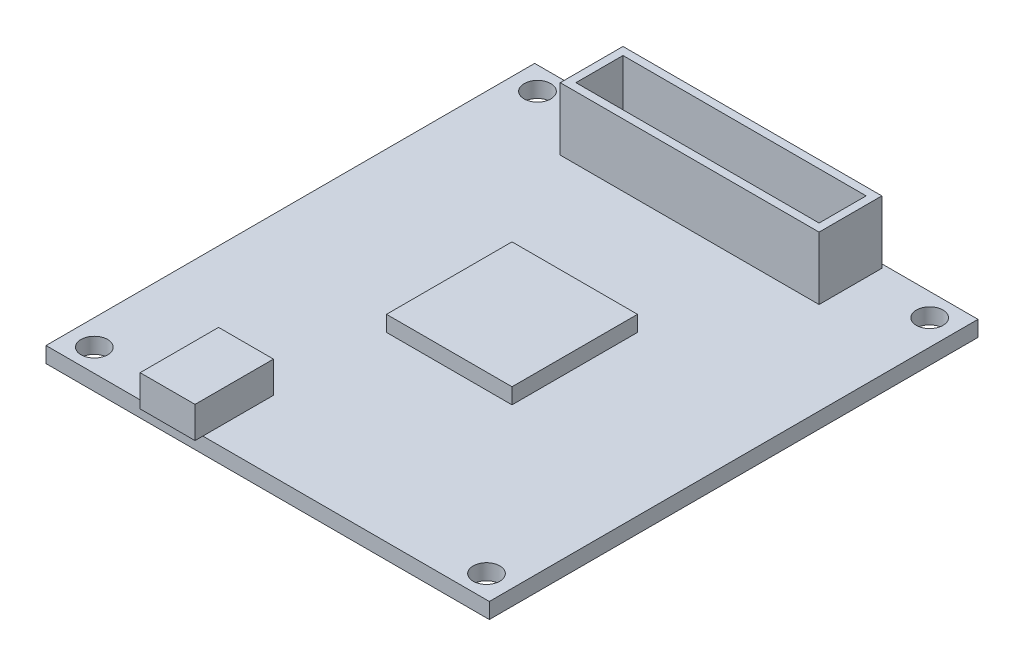
ISO-10303-21;
HEADER;
FILE_DESCRIPTION(('STEP AP214'),'2;1');
FILE_NAME('part.step','',(''),(''),'','','');
FILE_SCHEMA(('AUTOMOTIVE_DESIGN { 1 0 10303 214 1 1 1 1 }'));
ENDSEC;
DATA;
#1=APPLICATION_CONTEXT('core data for automotive mechanical design processes');
#2=APPLICATION_PROTOCOL_DEFINITION('international standard','automotive_design',2000,#1);
#3=PRODUCT_CONTEXT('',#1,'mechanical');
#4=PRODUCT('Part','Part','',(#3));
#5=PRODUCT_RELATED_PRODUCT_CATEGORY('part','',(#4));
#6=PRODUCT_DEFINITION_FORMATION('','',#4);
#7=PRODUCT_DEFINITION_CONTEXT('part definition',#1,'design');
#8=PRODUCT_DEFINITION('design','',#6,#7);
#9=PRODUCT_DEFINITION_SHAPE('','',#8);
#10=(LENGTH_UNIT() NAMED_UNIT(*) SI_UNIT(.MILLI.,.METRE.));
#11=(NAMED_UNIT(*) PLANE_ANGLE_UNIT() SI_UNIT($,.RADIAN.));
#12=(NAMED_UNIT(*) SI_UNIT($,.STERADIAN.) SOLID_ANGLE_UNIT());
#13=UNCERTAINTY_MEASURE_WITH_UNIT(LENGTH_MEASURE(1.E-05),#10,'distance_accuracy_value','');
#14=(GEOMETRIC_REPRESENTATION_CONTEXT(3) GLOBAL_UNCERTAINTY_ASSIGNED_CONTEXT((#13)) GLOBAL_UNIT_ASSIGNED_CONTEXT((#10,
#11,#12)) REPRESENTATION_CONTEXT('',''));
#15=CARTESIAN_POINT('',(0.,0.,0.));
#16=DIRECTION('',(0.,0.,1.));
#17=DIRECTION('',(1.,0.,0.));
#18=AXIS2_PLACEMENT_3D('',#15,#16,#17);
#19=CARTESIAN_POINT('',(0.,2.,0.));
#20=DIRECTION('',(0.,-1.,0.));
#21=DIRECTION('',(0.,0.,-1.));
#22=AXIS2_PLACEMENT_3D('',#19,#20,#21);
#23=PLANE('',#22);
#24=DIRECTION('',(0.,0.,1.));
#25=VECTOR('',#24,1.);
#26=CARTESIAN_POINT('',(-16.5,2.,-30.65));
#27=LINE('',#26,#25);
#28=CARTESIAN_POINT('',(-16.5,2.,-30.65));
#29=VERTEX_POINT('',#28);
#30=CARTESIAN_POINT('',(-16.5,2.,-22.65));
#31=VERTEX_POINT('',#30);
#32=EDGE_CURVE('E235',#29,#31,#27,.T.);
#33=ORIENTED_EDGE('',*,*,#32,.F.);
#34=DIRECTION('',(-1.,0.,0.));
#35=VECTOR('',#34,1.);
#36=CARTESIAN_POINT('',(16.5,2.,-30.65));
#37=LINE('',#36,#35);
#38=CARTESIAN_POINT('',(16.5,2.,-30.65));
#39=VERTEX_POINT('',#38);
#40=EDGE_CURVE('E246',#39,#29,#37,.T.);
#41=ORIENTED_EDGE('',*,*,#40,.F.);
#42=DIRECTION('',(0.,0.,-1.));
#43=VECTOR('',#42,1.);
#44=CARTESIAN_POINT('',(16.5,2.,-30.65));
#45=LINE('',#44,#43);
#46=CARTESIAN_POINT('',(16.5,2.,-22.65));
#47=VERTEX_POINT('',#46);
#48=EDGE_CURVE('E258',#47,#39,#45,.T.);
#49=ORIENTED_EDGE('',*,*,#48,.F.);
#50=DIRECTION('',(1.,0.,0.));
#51=VECTOR('',#50,1.);
#52=CARTESIAN_POINT('',(16.5,2.,-22.65));
#53=LINE('',#52,#51);
#54=EDGE_CURVE('E255',#31,#47,#53,.T.);
#55=ORIENTED_EDGE('',*,*,#54,.F.);
#56=EDGE_LOOP('',(#33,#41,#49,#55));
#57=FACE_BOUND('',#56,.T.);
#58=CARTESIAN_POINT('',(-25.,2.,-28.25));
#59=DIRECTION('',(0.,1.,0.));
#60=DIRECTION('',(0.,0.,-1.));
#61=AXIS2_PLACEMENT_3D('',#58,#59,#60);
#62=CIRCLE('',#61,1.7);
#63=CARTESIAN_POINT('',(-25.,2.,-29.95));
#64=VERTEX_POINT('',#63);
#65=EDGE_CURVE('E308',#64,#64,#62,.T.);
#66=ORIENTED_EDGE('',*,*,#65,.F.);
#67=EDGE_LOOP('',(#66));
#68=FACE_BOUND('',#67,.T.);
#69=CARTESIAN_POINT('',(-25.,2.,28.25));
#70=DIRECTION('',(0.,1.,0.));
#71=DIRECTION('',(0.,0.,1.));
#72=AXIS2_PLACEMENT_3D('',#69,#70,#71);
#73=CIRCLE('',#72,1.7);
#74=CARTESIAN_POINT('',(-25.,2.,29.95));
#75=VERTEX_POINT('',#74);
#76=EDGE_CURVE('E314',#75,#75,#73,.T.);
#77=ORIENTED_EDGE('',*,*,#76,.F.);
#78=EDGE_LOOP('',(#77));
#79=FACE_BOUND('',#78,.T.);
#80=CARTESIAN_POINT('',(25.,2.,28.25));
#81=DIRECTION('',(0.,1.,0.));
#82=DIRECTION('',(0.,0.,-1.));
#83=AXIS2_PLACEMENT_3D('',#80,#81,#82);
#84=CIRCLE('',#83,1.7);
#85=CARTESIAN_POINT('',(25.,2.,26.55));
#86=VERTEX_POINT('',#85);
#87=EDGE_CURVE('E320',#86,#86,#84,.T.);
#88=ORIENTED_EDGE('',*,*,#87,.F.);
#89=EDGE_LOOP('',(#88));
#90=FACE_BOUND('',#89,.T.);
#91=CARTESIAN_POINT('',(25.,2.,-28.25));
#92=DIRECTION('',(0.,1.,0.));
#93=DIRECTION('',(0.,0.,1.));
#94=AXIS2_PLACEMENT_3D('',#91,#92,#93);
#95=CIRCLE('',#94,1.7);
#96=CARTESIAN_POINT('',(25.,2.,-26.55));
#97=VERTEX_POINT('',#96);
#98=EDGE_CURVE('E326',#97,#97,#95,.T.);
#99=ORIENTED_EDGE('',*,*,#98,.F.);
#100=EDGE_LOOP('',(#99));
#101=FACE_BOUND('',#100,.T.);
#102=DIRECTION('',(0.,0.,-1.));
#103=VECTOR('',#102,1.);
#104=CARTESIAN_POINT('',(8.,2.,-8.));
#105=LINE('',#104,#103);
#106=CARTESIAN_POINT('',(8.,2.,8.));
#107=VERTEX_POINT('',#106);
#108=CARTESIAN_POINT('',(8.,2.,-8.));
#109=VERTEX_POINT('',#108);
#110=EDGE_CURVE('E274',#107,#109,#105,.T.);
#111=ORIENTED_EDGE('',*,*,#110,.F.);
#112=DIRECTION('',(1.,0.,0.));
#113=VECTOR('',#112,1.);
#114=CARTESIAN_POINT('',(-8.,2.,8.));
#115=LINE('',#114,#113);
#116=CARTESIAN_POINT('',(-8.,2.,8.));
#117=VERTEX_POINT('',#116);
#118=EDGE_CURVE('E279',#117,#107,#115,.T.);
#119=ORIENTED_EDGE('',*,*,#118,.F.);
#120=DIRECTION('',(0.,0.,1.));
#121=VECTOR('',#120,1.);
#122=CARTESIAN_POINT('',(-8.,2.,-8.));
#123=LINE('',#122,#121);
#124=CARTESIAN_POINT('',(-8.,2.,-8.));
#125=VERTEX_POINT('',#124);
#126=EDGE_CURVE('E291',#125,#117,#123,.T.);
#127=ORIENTED_EDGE('',*,*,#126,.F.);
#128=DIRECTION('',(-1.,0.,0.));
#129=VECTOR('',#128,1.);
#130=CARTESIAN_POINT('',(-8.,2.,-8.));
#131=LINE('',#130,#129);
#132=EDGE_CURVE('E288',#109,#125,#131,.T.);
#133=ORIENTED_EDGE('',*,*,#132,.F.);
#134=EDGE_LOOP('',(#111,#119,#127,#133));
#135=FACE_BOUND('',#134,.T.);
#136=DIRECTION('',(0.,0.,1.));
#137=VECTOR('',#136,1.);
#138=CARTESIAN_POINT('',(-15.26,2.,22.15));
#139=LINE('',#138,#137);
#140=CARTESIAN_POINT('',(-15.26,2.,22.15));
#141=VERTEX_POINT('',#140);
#142=CARTESIAN_POINT('',(-15.26,2.,31.15));
#143=VERTEX_POINT('',#142);
#144=EDGE_CURVE('E52',#141,#143,#139,.T.);
#145=ORIENTED_EDGE('',*,*,#144,.F.);
#146=DIRECTION('',(-1.,0.,0.));
#147=VECTOR('',#146,1.);
#148=CARTESIAN_POINT('',(-8.25999999999999,2.,22.15));
#149=LINE('',#148,#147);
#150=CARTESIAN_POINT('',(-8.25999999999999,2.,22.15));
#151=VERTEX_POINT('',#150);
#152=EDGE_CURVE('E56',#151,#141,#149,.T.);
#153=ORIENTED_EDGE('',*,*,#152,.F.);
#154=DIRECTION('',(0.,0.,-1.));
#155=VECTOR('',#154,1.);
#156=CARTESIAN_POINT('',(-8.25999999999999,2.,22.15));
#157=LINE('',#156,#155);
#158=CARTESIAN_POINT('',(-8.25999999999999,2.,31.15));
#159=VERTEX_POINT('',#158);
#160=EDGE_CURVE('E376',#159,#151,#157,.T.);
#161=ORIENTED_EDGE('',*,*,#160,.F.);
#162=DIRECTION('',(1.,0.,0.));
#163=VECTOR('',#162,1.);
#164=CARTESIAN_POINT('',(-28.26,2.,31.15));
#165=LINE('',#164,#163);
#166=CARTESIAN_POINT('',(28.26,2.,31.15));
#167=VERTEX_POINT('',#166);
#168=EDGE_CURVE('E340',#159,#167,#165,.T.);
#169=ORIENTED_EDGE('',*,*,#168,.T.);
#170=DIRECTION('',(0.,0.,-1.));
#171=VECTOR('',#170,1.);
#172=CARTESIAN_POINT('',(28.26,2.,31.15));
#173=LINE('',#172,#171);
#174=CARTESIAN_POINT('',(28.26,2.,-31.15));
#175=VERTEX_POINT('',#174);
#176=EDGE_CURVE('E332',#167,#175,#173,.T.);
#177=ORIENTED_EDGE('',*,*,#176,.T.);
#178=DIRECTION('',(-1.,0.,0.));
#179=VECTOR('',#178,1.);
#180=CARTESIAN_POINT('',(-28.26,2.,-31.15));
#181=LINE('',#180,#179);
#182=CARTESIAN_POINT('',(-28.26,2.,-31.15));
#183=VERTEX_POINT('',#182);
#184=EDGE_CURVE('E335',#175,#183,#181,.T.);
#185=ORIENTED_EDGE('',*,*,#184,.T.);
#186=DIRECTION('',(0.,0.,1.));
#187=VECTOR('',#186,1.);
#188=CARTESIAN_POINT('',(-28.26,2.,31.15));
#189=LINE('',#188,#187);
#190=CARTESIAN_POINT('',(-28.26,2.,31.15));
#191=VERTEX_POINT('',#190);
#192=EDGE_CURVE('E338',#183,#191,#189,.T.);
#193=ORIENTED_EDGE('',*,*,#192,.T.);
#194=EDGE_CURVE('E341',#191,#143,#165,.T.);
#195=ORIENTED_EDGE('',*,*,#194,.T.);
#196=EDGE_LOOP('',(#145,#153,#161,#169,#177,#185,#193,#195));
#197=FACE_BOUND('',#196,.T.);
#198=ADVANCED_FACE('F37',(#57,#68,#79,#90,#101,#135,#197),#23,.F.);
#199=CARTESIAN_POINT('',(0.,0.,0.));
#200=DIRECTION('',(0.,-1.,0.));
#201=DIRECTION('',(0.,0.,-1.));
#202=AXIS2_PLACEMENT_3D('',#199,#200,#201);
#203=PLANE('',#202);
#204=CARTESIAN_POINT('',(-25.,0.,28.25));
#205=DIRECTION('',(0.,1.,0.));
#206=DIRECTION('',(0.,0.,1.));
#207=AXIS2_PLACEMENT_3D('',#204,#205,#206);
#208=CIRCLE('',#207,1.7);
#209=CARTESIAN_POINT('',(-25.,0.,29.95));
#210=VERTEX_POINT('',#209);
#211=EDGE_CURVE('E311',#210,#210,#208,.T.);
#212=ORIENTED_EDGE('',*,*,#211,.T.);
#213=EDGE_LOOP('',(#212));
#214=FACE_BOUND('',#213,.T.);
#215=CARTESIAN_POINT('',(25.,0.,-28.25));
#216=DIRECTION('',(0.,1.,0.));
#217=DIRECTION('',(0.,0.,1.));
#218=AXIS2_PLACEMENT_3D('',#215,#216,#217);
#219=CIRCLE('',#218,1.7);
#220=CARTESIAN_POINT('',(25.,0.,-26.55));
#221=VERTEX_POINT('',#220);
#222=EDGE_CURVE('E323',#221,#221,#219,.T.);
#223=ORIENTED_EDGE('',*,*,#222,.T.);
#224=EDGE_LOOP('',(#223));
#225=FACE_BOUND('',#224,.T.);
#226=DIRECTION('',(0.,0.,-1.));
#227=VECTOR('',#226,1.);
#228=CARTESIAN_POINT('',(28.26,0.,31.15));
#229=LINE('',#228,#227);
#230=CARTESIAN_POINT('',(28.26,0.,31.15));
#231=VERTEX_POINT('',#230);
#232=CARTESIAN_POINT('',(28.26,0.,-31.15));
#233=VERTEX_POINT('',#232);
#234=EDGE_CURVE('E329',#231,#233,#229,.T.);
#235=ORIENTED_EDGE('',*,*,#234,.F.);
#236=DIRECTION('',(1.,0.,0.));
#237=VECTOR('',#236,1.);
#238=CARTESIAN_POINT('',(-28.26,0.,31.15));
#239=LINE('',#238,#237);
#240=CARTESIAN_POINT('',(-28.26,0.,31.15));
#241=VERTEX_POINT('',#240);
#242=EDGE_CURVE('E336',#241,#231,#239,.T.);
#243=ORIENTED_EDGE('',*,*,#242,.F.);
#244=DIRECTION('',(0.,0.,1.));
#245=VECTOR('',#244,1.);
#246=CARTESIAN_POINT('',(-28.26,0.,31.15));
#247=LINE('',#246,#245);
#248=CARTESIAN_POINT('',(-28.26,0.,-31.15));
#249=VERTEX_POINT('',#248);
#250=EDGE_CURVE('E349',#249,#241,#247,.T.);
#251=ORIENTED_EDGE('',*,*,#250,.F.);
#252=DIRECTION('',(-1.,0.,0.));
#253=VECTOR('',#252,1.);
#254=CARTESIAN_POINT('',(-28.26,0.,-31.15));
#255=LINE('',#254,#253);
#256=EDGE_CURVE('E347',#233,#249,#255,.T.);
#257=ORIENTED_EDGE('',*,*,#256,.F.);
#258=EDGE_LOOP('',(#235,#243,#251,#257));
#259=FACE_BOUND('',#258,.T.);
#260=CARTESIAN_POINT('',(25.,0.,28.25));
#261=DIRECTION('',(0.,1.,0.));
#262=DIRECTION('',(0.,0.,-1.));
#263=AXIS2_PLACEMENT_3D('',#260,#261,#262);
#264=CIRCLE('',#263,1.7);
#265=CARTESIAN_POINT('',(25.,0.,26.55));
#266=VERTEX_POINT('',#265);
#267=EDGE_CURVE('E317',#266,#266,#264,.T.);
#268=ORIENTED_EDGE('',*,*,#267,.T.);
#269=EDGE_LOOP('',(#268));
#270=FACE_BOUND('',#269,.T.);
#271=CARTESIAN_POINT('',(-25.,0.,-28.25));
#272=DIRECTION('',(0.,1.,0.));
#273=DIRECTION('',(0.,0.,-1.));
#274=AXIS2_PLACEMENT_3D('',#271,#272,#273);
#275=CIRCLE('',#274,1.7);
#276=CARTESIAN_POINT('',(-25.,0.,-29.95));
#277=VERTEX_POINT('',#276);
#278=EDGE_CURVE('E307',#277,#277,#275,.T.);
#279=ORIENTED_EDGE('',*,*,#278,.T.);
#280=EDGE_LOOP('',(#279));
#281=FACE_BOUND('',#280,.T.);
#282=ADVANCED_FACE('F367',(#214,#225,#259,#270,#281),#203,.T.);
#283=CARTESIAN_POINT('',(28.26,2.,31.15));
#284=DIRECTION('',(-1.,0.,0.));
#285=DIRECTION('',(0.,0.,1.));
#286=AXIS2_PLACEMENT_3D('',#283,#284,#285);
#287=PLANE('',#286);
#288=ORIENTED_EDGE('',*,*,#234,.T.);
#289=DIRECTION('',(0.,-1.,0.));
#290=VECTOR('',#289,1.);
#291=CARTESIAN_POINT('',(28.26,2.,-31.15));
#292=LINE('',#291,#290);
#293=EDGE_CURVE('E11',#175,#233,#292,.T.);
#294=ORIENTED_EDGE('',*,*,#293,.F.);
#295=ORIENTED_EDGE('',*,*,#176,.F.);
#296=DIRECTION('',(0.,-1.,0.));
#297=VECTOR('',#296,1.);
#298=CARTESIAN_POINT('',(28.26,2.,31.15));
#299=LINE('',#298,#297);
#300=EDGE_CURVE('E343',#167,#231,#299,.T.);
#301=ORIENTED_EDGE('',*,*,#300,.T.);
#302=EDGE_LOOP('',(#288,#294,#295,#301));
#303=FACE_BOUND('',#302,.T.);
#304=ADVANCED_FACE('F39',(#303),#287,.F.);
#305=CARTESIAN_POINT('',(-28.26,2.,-31.15));
#306=DIRECTION('',(0.,0.,1.));
#307=DIRECTION('',(1.,0.,0.));
#308=AXIS2_PLACEMENT_3D('',#305,#306,#307);
#309=PLANE('',#308);
#310=ORIENTED_EDGE('',*,*,#256,.T.);
#311=DIRECTION('',(0.,-1.,0.));
#312=VECTOR('',#311,1.);
#313=CARTESIAN_POINT('',(-28.26,2.,-31.15));
#314=LINE('',#313,#312);
#315=EDGE_CURVE('E45',#183,#249,#314,.T.);
#316=ORIENTED_EDGE('',*,*,#315,.F.);
#317=ORIENTED_EDGE('',*,*,#184,.F.);
#318=ORIENTED_EDGE('',*,*,#293,.T.);
#319=EDGE_LOOP('',(#310,#316,#317,#318));
#320=FACE_BOUND('',#319,.T.);
#321=ADVANCED_FACE('F423',(#320),#309,.F.);
#322=CARTESIAN_POINT('',(-28.26,2.,31.15));
#323=DIRECTION('',(1.,0.,0.));
#324=DIRECTION('',(0.,0.,-1.));
#325=AXIS2_PLACEMENT_3D('',#322,#323,#324);
#326=PLANE('',#325);
#327=ORIENTED_EDGE('',*,*,#250,.T.);
#328=DIRECTION('',(0.,-1.,0.));
#329=VECTOR('',#328,1.);
#330=CARTESIAN_POINT('',(-28.26,2.,31.15));
#331=LINE('',#330,#329);
#332=EDGE_CURVE('E354',#191,#241,#331,.T.);
#333=ORIENTED_EDGE('',*,*,#332,.F.);
#334=ORIENTED_EDGE('',*,*,#192,.F.);
#335=ORIENTED_EDGE('',*,*,#315,.T.);
#336=EDGE_LOOP('',(#327,#333,#334,#335));
#337=FACE_BOUND('',#336,.T.);
#338=ADVANCED_FACE('F361',(#337),#326,.F.);
#339=CARTESIAN_POINT('',(-28.26,2.,31.15));
#340=DIRECTION('',(0.,0.,-1.));
#341=DIRECTION('',(-1.,0.,0.));
#342=AXIS2_PLACEMENT_3D('',#339,#340,#341);
#343=PLANE('',#342);
#344=ORIENTED_EDGE('',*,*,#242,.T.);
#345=ORIENTED_EDGE('',*,*,#300,.F.);
#346=ORIENTED_EDGE('',*,*,#168,.F.);
#347=EDGE_CURVE('E344',#143,#159,#165,.T.);
#348=ORIENTED_EDGE('',*,*,#347,.F.);
#349=ORIENTED_EDGE('',*,*,#194,.F.);
#350=ORIENTED_EDGE('',*,*,#332,.T.);
#351=EDGE_LOOP('',(#344,#345,#346,#348,#349,#350));
#352=FACE_BOUND('',#351,.T.);
#353=ADVANCED_FACE('F371',(#352),#343,.F.);
#354=CARTESIAN_POINT('',(25.,2.,-28.25));
#355=DIRECTION('',(0.,-1.,0.));
#356=DIRECTION('',(0.,0.,-1.));
#357=AXIS2_PLACEMENT_3D('',#354,#355,#356);
#358=CYLINDRICAL_SURFACE('',#357,1.7);
#359=ORIENTED_EDGE('',*,*,#98,.T.);
#360=EDGE_LOOP('',(#359));
#361=FACE_BOUND('',#360,.T.);
#362=ORIENTED_EDGE('',*,*,#222,.F.);
#363=EDGE_LOOP('',(#362));
#364=FACE_BOUND('',#363,.T.);
#365=ADVANCED_FACE('F417',(#361,#364),#358,.F.);
#366=CARTESIAN_POINT('',(25.,2.,28.25));
#367=DIRECTION('',(0.,-1.,0.));
#368=DIRECTION('',(0.,0.,-1.));
#369=AXIS2_PLACEMENT_3D('',#366,#367,#368);
#370=CYLINDRICAL_SURFACE('',#369,1.7);
#371=ORIENTED_EDGE('',*,*,#87,.T.);
#372=EDGE_LOOP('',(#371));
#373=FACE_BOUND('',#372,.T.);
#374=ORIENTED_EDGE('',*,*,#267,.F.);
#375=EDGE_LOOP('',(#374));
#376=FACE_BOUND('',#375,.T.);
#377=ADVANCED_FACE('F461',(#373,#376),#370,.F.);
#378=CARTESIAN_POINT('',(-25.,2.,28.25));
#379=DIRECTION('',(0.,-1.,0.));
#380=DIRECTION('',(0.,0.,-1.));
#381=AXIS2_PLACEMENT_3D('',#378,#379,#380);
#382=CYLINDRICAL_SURFACE('',#381,1.7);
#383=ORIENTED_EDGE('',*,*,#76,.T.);
#384=EDGE_LOOP('',(#383));
#385=FACE_BOUND('',#384,.T.);
#386=ORIENTED_EDGE('',*,*,#211,.F.);
#387=EDGE_LOOP('',(#386));
#388=FACE_BOUND('',#387,.T.);
#389=ADVANCED_FACE('F469',(#385,#388),#382,.F.);
#390=CARTESIAN_POINT('',(-25.,2.,-28.25));
#391=DIRECTION('',(0.,-1.,0.));
#392=DIRECTION('',(0.,0.,-1.));
#393=AXIS2_PLACEMENT_3D('',#390,#391,#392);
#394=CYLINDRICAL_SURFACE('',#393,1.7);
#395=ORIENTED_EDGE('',*,*,#65,.T.);
#396=EDGE_LOOP('',(#395));
#397=FACE_BOUND('',#396,.T.);
#398=ORIENTED_EDGE('',*,*,#278,.F.);
#399=EDGE_LOOP('',(#398));
#400=FACE_BOUND('',#399,.T.);
#401=ADVANCED_FACE('F477',(#397,#400),#394,.F.);
#402=CARTESIAN_POINT('',(8.,4.,-8.));
#403=DIRECTION('',(-1.,0.,0.));
#404=DIRECTION('',(0.,0.,1.));
#405=AXIS2_PLACEMENT_3D('',#402,#403,#404);
#406=PLANE('',#405);
#407=ORIENTED_EDGE('',*,*,#110,.T.);
#408=DIRECTION('',(0.,-1.,0.));
#409=VECTOR('',#408,1.);
#410=CARTESIAN_POINT('',(8.,4.,-8.));
#411=LINE('',#410,#409);
#412=CARTESIAN_POINT('',(8.,4.,-8.));
#413=VERTEX_POINT('',#412);
#414=EDGE_CURVE('E304',#413,#109,#411,.T.);
#415=ORIENTED_EDGE('',*,*,#414,.F.);
#416=DIRECTION('',(0.,0.,-1.));
#417=VECTOR('',#416,1.);
#418=CARTESIAN_POINT('',(8.,4.,-8.));
#419=LINE('',#418,#417);
#420=CARTESIAN_POINT('',(8.,4.,8.));
#421=VERTEX_POINT('',#420);
#422=EDGE_CURVE('E275',#421,#413,#419,.T.);
#423=ORIENTED_EDGE('',*,*,#422,.F.);
#424=DIRECTION('',(0.,-1.,0.));
#425=VECTOR('',#424,1.);
#426=CARTESIAN_POINT('',(8.,4.,8.));
#427=LINE('',#426,#425);
#428=EDGE_CURVE('E285',#421,#107,#427,.T.);
#429=ORIENTED_EDGE('',*,*,#428,.T.);
#430=EDGE_LOOP('',(#407,#415,#423,#429));
#431=FACE_BOUND('',#430,.T.);
#432=ADVANCED_FACE('F486',(#431),#406,.F.);
#433=CARTESIAN_POINT('',(-8.,4.,-8.));
#434=DIRECTION('',(0.,0.,1.));
#435=DIRECTION('',(1.,0.,0.));
#436=AXIS2_PLACEMENT_3D('',#433,#434,#435);
#437=PLANE('',#436);
#438=ORIENTED_EDGE('',*,*,#132,.T.);
#439=DIRECTION('',(0.,-1.,0.));
#440=VECTOR('',#439,1.);
#441=CARTESIAN_POINT('',(-8.,4.,-8.));
#442=LINE('',#441,#440);
#443=CARTESIAN_POINT('',(-8.,4.,-8.));
#444=VERTEX_POINT('',#443);
#445=EDGE_CURVE('E301',#444,#125,#442,.T.);
#446=ORIENTED_EDGE('',*,*,#445,.F.);
#447=DIRECTION('',(-1.,0.,0.));
#448=VECTOR('',#447,1.);
#449=CARTESIAN_POINT('',(-8.,4.,-8.));
#450=LINE('',#449,#448);
#451=EDGE_CURVE('E278',#413,#444,#450,.T.);
#452=ORIENTED_EDGE('',*,*,#451,.F.);
#453=ORIENTED_EDGE('',*,*,#414,.T.);
#454=EDGE_LOOP('',(#438,#446,#452,#453));
#455=FACE_BOUND('',#454,.T.);
#456=ADVANCED_FACE('F495',(#455),#437,.F.);
#457=CARTESIAN_POINT('',(-8.,4.,-8.));
#458=DIRECTION('',(1.,0.,0.));
#459=DIRECTION('',(0.,0.,-1.));
#460=AXIS2_PLACEMENT_3D('',#457,#458,#459);
#461=PLANE('',#460);
#462=ORIENTED_EDGE('',*,*,#126,.T.);
#463=DIRECTION('',(0.,-1.,0.));
#464=VECTOR('',#463,1.);
#465=CARTESIAN_POINT('',(-8.,4.,8.));
#466=LINE('',#465,#464);
#467=CARTESIAN_POINT('',(-8.,4.,8.));
#468=VERTEX_POINT('',#467);
#469=EDGE_CURVE('E298',#468,#117,#466,.T.);
#470=ORIENTED_EDGE('',*,*,#469,.F.);
#471=DIRECTION('',(0.,0.,1.));
#472=VECTOR('',#471,1.);
#473=CARTESIAN_POINT('',(-8.,4.,-8.));
#474=LINE('',#473,#472);
#475=EDGE_CURVE('E281',#444,#468,#474,.T.);
#476=ORIENTED_EDGE('',*,*,#475,.F.);
#477=ORIENTED_EDGE('',*,*,#445,.T.);
#478=EDGE_LOOP('',(#462,#470,#476,#477));
#479=FACE_BOUND('',#478,.T.);
#480=ADVANCED_FACE('F504',(#479),#461,.F.);
#481=CARTESIAN_POINT('',(-8.,4.,8.));
#482=DIRECTION('',(0.,0.,-1.));
#483=DIRECTION('',(-1.,0.,0.));
#484=AXIS2_PLACEMENT_3D('',#481,#482,#483);
#485=PLANE('',#484);
#486=ORIENTED_EDGE('',*,*,#118,.T.);
#487=ORIENTED_EDGE('',*,*,#428,.F.);
#488=DIRECTION('',(1.,0.,0.));
#489=VECTOR('',#488,1.);
#490=CARTESIAN_POINT('',(-8.,4.,8.));
#491=LINE('',#490,#489);
#492=EDGE_CURVE('E283',#468,#421,#491,.T.);
#493=ORIENTED_EDGE('',*,*,#492,.F.);
#494=ORIENTED_EDGE('',*,*,#469,.T.);
#495=EDGE_LOOP('',(#486,#487,#493,#494));
#496=FACE_BOUND('',#495,.T.);
#497=ADVANCED_FACE('F513',(#496),#485,.F.);
#498=CARTESIAN_POINT('',(0.,4.,0.));
#499=DIRECTION('',(0.,1.,0.));
#500=DIRECTION('',(0.,0.,1.));
#501=AXIS2_PLACEMENT_3D('',#498,#499,#500);
#502=PLANE('',#501);
#503=ORIENTED_EDGE('',*,*,#422,.T.);
#504=ORIENTED_EDGE('',*,*,#451,.T.);
#505=ORIENTED_EDGE('',*,*,#475,.T.);
#506=ORIENTED_EDGE('',*,*,#492,.T.);
#507=EDGE_LOOP('',(#503,#504,#505,#506));
#508=FACE_BOUND('',#507,.T.);
#509=ADVANCED_FACE('F522',(#508),#502,.T.);
#510=CARTESIAN_POINT('',(-16.5,10.,-30.65));
#511=DIRECTION('',(1.,0.,0.));
#512=DIRECTION('',(0.,0.,-1.));
#513=AXIS2_PLACEMENT_3D('',#510,#511,#512);
#514=PLANE('',#513);
#515=ORIENTED_EDGE('',*,*,#32,.T.);
#516=DIRECTION('',(0.,-1.,0.));
#517=VECTOR('',#516,1.);
#518=CARTESIAN_POINT('',(-16.5,10.,-22.65));
#519=LINE('',#518,#517);
#520=CARTESIAN_POINT('',(-16.5,10.,-22.65));
#521=VERTEX_POINT('',#520);
#522=EDGE_CURVE('E271',#521,#31,#519,.T.);
#523=ORIENTED_EDGE('',*,*,#522,.F.);
#524=DIRECTION('',(0.,0.,1.));
#525=VECTOR('',#524,1.);
#526=CARTESIAN_POINT('',(-16.5,10.,-30.65));
#527=LINE('',#526,#525);
#528=CARTESIAN_POINT('',(-16.5,10.,-30.65));
#529=VERTEX_POINT('',#528);
#530=EDGE_CURVE('E242',#529,#521,#527,.T.);
#531=ORIENTED_EDGE('',*,*,#530,.F.);
#532=DIRECTION('',(0.,-1.,0.));
#533=VECTOR('',#532,1.);
#534=CARTESIAN_POINT('',(-16.5,10.,-30.65));
#535=LINE('',#534,#533);
#536=EDGE_CURVE('E252',#529,#29,#535,.T.);
#537=ORIENTED_EDGE('',*,*,#536,.T.);
#538=EDGE_LOOP('',(#515,#523,#531,#537));
#539=FACE_BOUND('',#538,.T.);
#540=ADVANCED_FACE('F531',(#539),#514,.F.);
#541=CARTESIAN_POINT('',(16.5,10.,-22.65));
#542=DIRECTION('',(0.,0.,-1.));
#543=DIRECTION('',(-1.,0.,0.));
#544=AXIS2_PLACEMENT_3D('',#541,#542,#543);
#545=PLANE('',#544);
#546=ORIENTED_EDGE('',*,*,#54,.T.);
#547=DIRECTION('',(0.,-1.,0.));
#548=VECTOR('',#547,1.);
#549=CARTESIAN_POINT('',(16.5,10.,-22.65));
#550=LINE('',#549,#548);
#551=CARTESIAN_POINT('',(16.5,10.,-22.65));
#552=VERTEX_POINT('',#551);
#553=EDGE_CURVE('E268',#552,#47,#550,.T.);
#554=ORIENTED_EDGE('',*,*,#553,.F.);
#555=DIRECTION('',(1.,0.,0.));
#556=VECTOR('',#555,1.);
#557=CARTESIAN_POINT('',(16.5,10.,-22.65));
#558=LINE('',#557,#556);
#559=EDGE_CURVE('E245',#521,#552,#558,.T.);
#560=ORIENTED_EDGE('',*,*,#559,.F.);
#561=ORIENTED_EDGE('',*,*,#522,.T.);
#562=EDGE_LOOP('',(#546,#554,#560,#561));
#563=FACE_BOUND('',#562,.T.);
#564=ADVANCED_FACE('F540',(#563),#545,.F.);
#565=CARTESIAN_POINT('',(16.5,10.,-30.65));
#566=DIRECTION('',(-1.,0.,0.));
#567=DIRECTION('',(0.,0.,1.));
#568=AXIS2_PLACEMENT_3D('',#565,#566,#567);
#569=PLANE('',#568);
#570=ORIENTED_EDGE('',*,*,#48,.T.);
#571=DIRECTION('',(0.,-1.,0.));
#572=VECTOR('',#571,1.);
#573=CARTESIAN_POINT('',(16.5,10.,-30.65));
#574=LINE('',#573,#572);
#575=CARTESIAN_POINT('',(16.5,10.,-30.65));
#576=VERTEX_POINT('',#575);
#577=EDGE_CURVE('E265',#576,#39,#574,.T.);
#578=ORIENTED_EDGE('',*,*,#577,.F.);
#579=DIRECTION('',(0.,0.,-1.));
#580=VECTOR('',#579,1.);
#581=CARTESIAN_POINT('',(16.5,10.,-30.65));
#582=LINE('',#581,#580);
#583=EDGE_CURVE('E248',#552,#576,#582,.T.);
#584=ORIENTED_EDGE('',*,*,#583,.F.);
#585=ORIENTED_EDGE('',*,*,#553,.T.);
#586=EDGE_LOOP('',(#570,#578,#584,#585));
#587=FACE_BOUND('',#586,.T.);
#588=ADVANCED_FACE('F549',(#587),#569,.F.);
#589=CARTESIAN_POINT('',(16.5,10.,-30.65));
#590=DIRECTION('',(0.,0.,1.));
#591=DIRECTION('',(1.,0.,0.));
#592=AXIS2_PLACEMENT_3D('',#589,#590,#591);
#593=PLANE('',#592);
#594=ORIENTED_EDGE('',*,*,#40,.T.);
#595=ORIENTED_EDGE('',*,*,#536,.F.);
#596=DIRECTION('',(-1.,0.,0.));
#597=VECTOR('',#596,1.);
#598=CARTESIAN_POINT('',(16.5,10.,-30.65));
#599=LINE('',#598,#597);
#600=EDGE_CURVE('E250',#576,#529,#599,.T.);
#601=ORIENTED_EDGE('',*,*,#600,.F.);
#602=ORIENTED_EDGE('',*,*,#577,.T.);
#603=EDGE_LOOP('',(#594,#595,#601,#602));
#604=FACE_BOUND('',#603,.T.);
#605=ADVANCED_FACE('F558',(#604),#593,.F.);
#606=CARTESIAN_POINT('',(0.,10.,0.));
#607=DIRECTION('',(0.,-1.,0.));
#608=DIRECTION('',(0.,0.,-1.));
#609=AXIS2_PLACEMENT_3D('',#606,#607,#608);
#610=PLANE('',#609);
#611=DIRECTION('',(0.,0.,1.));
#612=VECTOR('',#611,1.);
#613=CARTESIAN_POINT('',(-15.5,10.,-29.65));
#614=LINE('',#613,#612);
#615=CARTESIAN_POINT('',(-15.5,10.,-29.65));
#616=VERTEX_POINT('',#615);
#617=CARTESIAN_POINT('',(-15.5,10.,-23.65));
#618=VERTEX_POINT('',#617);
#619=EDGE_CURVE('E206',#616,#618,#614,.T.);
#620=ORIENTED_EDGE('',*,*,#619,.F.);
#621=DIRECTION('',(-1.,0.,0.));
#622=VECTOR('',#621,1.);
#623=CARTESIAN_POINT('',(15.5,10.,-29.65));
#624=LINE('',#623,#622);
#625=CARTESIAN_POINT('',(15.5,10.,-29.65));
#626=VERTEX_POINT('',#625);
#627=EDGE_CURVE('E204',#626,#616,#624,.T.);
#628=ORIENTED_EDGE('',*,*,#627,.F.);
#629=DIRECTION('',(0.,0.,-1.));
#630=VECTOR('',#629,1.);
#631=CARTESIAN_POINT('',(15.5,10.,-23.65));
#632=LINE('',#631,#630);
#633=CARTESIAN_POINT('',(15.5,10.,-23.65));
#634=VERTEX_POINT('',#633);
#635=EDGE_CURVE('E216',#634,#626,#632,.T.);
#636=ORIENTED_EDGE('',*,*,#635,.F.);
#637=DIRECTION('',(1.,0.,0.));
#638=VECTOR('',#637,1.);
#639=CARTESIAN_POINT('',(-15.5,10.,-23.65));
#640=LINE('',#639,#638);
#641=EDGE_CURVE('E228',#618,#634,#640,.T.);
#642=ORIENTED_EDGE('',*,*,#641,.F.);
#643=EDGE_LOOP('',(#620,#628,#636,#642));
#644=FACE_BOUND('',#643,.T.);
#645=ORIENTED_EDGE('',*,*,#530,.T.);
#646=ORIENTED_EDGE('',*,*,#559,.T.);
#647=ORIENTED_EDGE('',*,*,#583,.T.);
#648=ORIENTED_EDGE('',*,*,#600,.T.);
#649=EDGE_LOOP('',(#645,#646,#647,#648));
#650=FACE_BOUND('',#649,.T.);
#651=ADVANCED_FACE('F567',(#644,#650),#610,.F.);
#652=CARTESIAN_POINT('',(15.5,2.,-29.65));
#653=DIRECTION('',(0.,0.,-1.));
#654=DIRECTION('',(-1.,0.,0.));
#655=AXIS2_PLACEMENT_3D('',#652,#653,#654);
#656=PLANE('',#655);
#657=ORIENTED_EDGE('',*,*,#627,.T.);
#658=DIRECTION('',(0.,1.,0.));
#659=VECTOR('',#658,1.);
#660=CARTESIAN_POINT('',(-15.5,2.,-29.65));
#661=LINE('',#660,#659);
#662=CARTESIAN_POINT('',(-15.5,2.,-29.65));
#663=VERTEX_POINT('',#662);
#664=EDGE_CURVE('E224',#663,#616,#661,.T.);
#665=ORIENTED_EDGE('',*,*,#664,.F.);
#666=DIRECTION('',(-1.,0.,0.));
#667=VECTOR('',#666,1.);
#668=CARTESIAN_POINT('',(15.5,2.,-29.65));
#669=LINE('',#668,#667);
#670=CARTESIAN_POINT('',(15.5,2.,-29.65));
#671=VERTEX_POINT('',#670);
#672=EDGE_CURVE('E212',#671,#663,#669,.T.);
#673=ORIENTED_EDGE('',*,*,#672,.F.);
#674=DIRECTION('',(0.,1.,0.));
#675=VECTOR('',#674,1.);
#676=CARTESIAN_POINT('',(15.5,2.,-29.65));
#677=LINE('',#676,#675);
#678=EDGE_CURVE('E233',#671,#626,#677,.T.);
#679=ORIENTED_EDGE('',*,*,#678,.T.);
#680=EDGE_LOOP('',(#657,#665,#673,#679));
#681=FACE_BOUND('',#680,.T.);
#682=ADVANCED_FACE('F576',(#681),#656,.F.);
#683=CARTESIAN_POINT('',(15.5,2.,-23.65));
#684=DIRECTION('',(1.,0.,0.));
#685=DIRECTION('',(0.,0.,-1.));
#686=AXIS2_PLACEMENT_3D('',#683,#684,#685);
#687=PLANE('',#686);
#688=ORIENTED_EDGE('',*,*,#635,.T.);
#689=ORIENTED_EDGE('',*,*,#678,.F.);
#690=DIRECTION('',(0.,0.,-1.));
#691=VECTOR('',#690,1.);
#692=CARTESIAN_POINT('',(15.5,2.,-23.65));
#693=LINE('',#692,#691);
#694=CARTESIAN_POINT('',(15.5,2.,-23.65));
#695=VERTEX_POINT('',#694);
#696=EDGE_CURVE('E222',#695,#671,#693,.T.);
#697=ORIENTED_EDGE('',*,*,#696,.F.);
#698=DIRECTION('',(0.,1.,0.));
#699=VECTOR('',#698,1.);
#700=CARTESIAN_POINT('',(15.5,2.,-23.65));
#701=LINE('',#700,#699);
#702=EDGE_CURVE('E236',#695,#634,#701,.T.);
#703=ORIENTED_EDGE('',*,*,#702,.T.);
#704=EDGE_LOOP('',(#688,#689,#697,#703));
#705=FACE_BOUND('',#704,.T.);
#706=ADVANCED_FACE('F585',(#705),#687,.F.);
#707=CARTESIAN_POINT('',(-15.5,2.,-23.65));
#708=DIRECTION('',(0.,0.,1.));
#709=DIRECTION('',(1.,0.,0.));
#710=AXIS2_PLACEMENT_3D('',#707,#708,#709);
#711=PLANE('',#710);
#712=ORIENTED_EDGE('',*,*,#641,.T.);
#713=ORIENTED_EDGE('',*,*,#702,.F.);
#714=DIRECTION('',(1.,0.,0.));
#715=VECTOR('',#714,1.);
#716=CARTESIAN_POINT('',(-15.5,2.,-23.65));
#717=LINE('',#716,#715);
#718=CARTESIAN_POINT('',(-15.5,2.,-23.65));
#719=VERTEX_POINT('',#718);
#720=EDGE_CURVE('E219',#719,#695,#717,.T.);
#721=ORIENTED_EDGE('',*,*,#720,.F.);
#722=DIRECTION('',(0.,1.,0.));
#723=VECTOR('',#722,1.);
#724=CARTESIAN_POINT('',(-15.5,2.,-23.65));
#725=LINE('',#724,#723);
#726=EDGE_CURVE('E238',#719,#618,#725,.T.);
#727=ORIENTED_EDGE('',*,*,#726,.T.);
#728=EDGE_LOOP('',(#712,#713,#721,#727));
#729=FACE_BOUND('',#728,.T.);
#730=ADVANCED_FACE('F594',(#729),#711,.F.);
#731=CARTESIAN_POINT('',(-15.5,2.,-29.65));
#732=DIRECTION('',(-1.,0.,0.));
#733=DIRECTION('',(0.,0.,1.));
#734=AXIS2_PLACEMENT_3D('',#731,#732,#733);
#735=PLANE('',#734);
#736=ORIENTED_EDGE('',*,*,#619,.T.);
#737=ORIENTED_EDGE('',*,*,#726,.F.);
#738=DIRECTION('',(0.,0.,1.));
#739=VECTOR('',#738,1.);
#740=CARTESIAN_POINT('',(-15.5,2.,-29.65));
#741=LINE('',#740,#739);
#742=EDGE_CURVE('E215',#663,#719,#741,.T.);
#743=ORIENTED_EDGE('',*,*,#742,.F.);
#744=ORIENTED_EDGE('',*,*,#664,.T.);
#745=EDGE_LOOP('',(#736,#737,#743,#744));
#746=FACE_BOUND('',#745,.T.);
#747=ADVANCED_FACE('F603',(#746),#735,.F.);
#748=CARTESIAN_POINT('',(0.,2.,0.));
#749=DIRECTION('',(0.,1.,0.));
#750=DIRECTION('',(0.,0.,1.));
#751=AXIS2_PLACEMENT_3D('',#748,#749,#750);
#752=PLANE('',#751);
#753=ORIENTED_EDGE('',*,*,#672,.T.);
#754=ORIENTED_EDGE('',*,*,#742,.T.);
#755=ORIENTED_EDGE('',*,*,#720,.T.);
#756=ORIENTED_EDGE('',*,*,#696,.T.);
#757=EDGE_LOOP('',(#753,#754,#755,#756));
#758=FACE_BOUND('',#757,.T.);
#759=ADVANCED_FACE('F612',(#758),#752,.T.);
#760=CARTESIAN_POINT('',(0.,2.,0.));
#761=DIRECTION('',(0.,-1.,0.));
#762=DIRECTION('',(0.,0.,-1.));
#763=AXIS2_PLACEMENT_3D('',#760,#761,#762);
#764=PLANE('',#763);
#765=ORIENTED_EDGE('',*,*,#347,.T.);
#766=CARTESIAN_POINT('',(-8.25999999999999,2.,32.15));
#767=VERTEX_POINT('',#766);
#768=EDGE_CURVE('E382',#767,#159,#157,.T.);
#769=ORIENTED_EDGE('',*,*,#768,.F.);
#770=DIRECTION('',(1.,0.,0.));
#771=VECTOR('',#770,1.);
#772=CARTESIAN_POINT('',(-8.25999999999999,2.,32.15));
#773=LINE('',#772,#771);
#774=CARTESIAN_POINT('',(-15.26,2.,32.15));
#775=VERTEX_POINT('',#774);
#776=EDGE_CURVE('E389',#775,#767,#773,.T.);
#777=ORIENTED_EDGE('',*,*,#776,.F.);
#778=EDGE_CURVE('E202',#143,#775,#139,.T.);
#779=ORIENTED_EDGE('',*,*,#778,.F.);
#780=EDGE_LOOP('',(#765,#769,#777,#779));
#781=FACE_BOUND('',#780,.T.);
#782=ADVANCED_FACE('F381',(#781),#764,.T.);
#783=CARTESIAN_POINT('',(-15.26,6.,22.15));
#784=DIRECTION('',(1.,0.,0.));
#785=DIRECTION('',(0.,0.,-1.));
#786=AXIS2_PLACEMENT_3D('',#783,#784,#785);
#787=PLANE('',#786);
#788=ORIENTED_EDGE('',*,*,#144,.T.);
#789=ORIENTED_EDGE('',*,*,#778,.T.);
#790=DIRECTION('',(0.,-1.,0.));
#791=VECTOR('',#790,1.);
#792=CARTESIAN_POINT('',(-15.26,6.,32.15));
#793=LINE('',#792,#791);
#794=CARTESIAN_POINT('',(-15.26,6.,32.15));
#795=VERTEX_POINT('',#794);
#796=EDGE_CURVE('E184',#795,#775,#793,.T.);
#797=ORIENTED_EDGE('',*,*,#796,.F.);
#798=DIRECTION('',(0.,0.,1.));
#799=VECTOR('',#798,1.);
#800=CARTESIAN_POINT('',(-15.26,6.,22.15));
#801=LINE('',#800,#799);
#802=CARTESIAN_POINT('',(-15.26,6.,22.15));
#803=VERTEX_POINT('',#802);
#804=EDGE_CURVE('E190',#803,#795,#801,.T.);
#805=ORIENTED_EDGE('',*,*,#804,.F.);
#806=DIRECTION('',(0.,-1.,0.));
#807=VECTOR('',#806,1.);
#808=CARTESIAN_POINT('',(-15.26,6.,22.15));
#809=LINE('',#808,#807);
#810=EDGE_CURVE('E393',#803,#141,#809,.T.);
#811=ORIENTED_EDGE('',*,*,#810,.T.);
#812=EDGE_LOOP('',(#788,#789,#797,#805,#811));
#813=FACE_BOUND('',#812,.T.);
#814=ADVANCED_FACE('F200',(#813),#787,.F.);
#815=CARTESIAN_POINT('',(-8.25999999999999,6.,32.15));
#816=DIRECTION('',(0.,0.,-1.));
#817=DIRECTION('',(-1.,0.,0.));
#818=AXIS2_PLACEMENT_3D('',#815,#816,#817);
#819=PLANE('',#818);
#820=ORIENTED_EDGE('',*,*,#776,.T.);
#821=DIRECTION('',(0.,-1.,0.));
#822=VECTOR('',#821,1.);
#823=CARTESIAN_POINT('',(-8.25999999999999,6.,32.15));
#824=LINE('',#823,#822);
#825=CARTESIAN_POINT('',(-8.25999999999999,6.,32.15));
#826=VERTEX_POINT('',#825);
#827=EDGE_CURVE('E186',#826,#767,#824,.T.);
#828=ORIENTED_EDGE('',*,*,#827,.F.);
#829=DIRECTION('',(1.,0.,0.));
#830=VECTOR('',#829,1.);
#831=CARTESIAN_POINT('',(-8.25999999999999,6.,32.15));
#832=LINE('',#831,#830);
#833=EDGE_CURVE('E180',#795,#826,#832,.T.);
#834=ORIENTED_EDGE('',*,*,#833,.F.);
#835=ORIENTED_EDGE('',*,*,#796,.T.);
#836=EDGE_LOOP('',(#820,#828,#834,#835));
#837=FACE_BOUND('',#836,.T.);
#838=ADVANCED_FACE('F182',(#837),#819,.F.);
#839=CARTESIAN_POINT('',(-8.25999999999999,6.,22.15));
#840=DIRECTION('',(-1.,0.,0.));
#841=DIRECTION('',(0.,0.,1.));
#842=AXIS2_PLACEMENT_3D('',#839,#840,#841);
#843=PLANE('',#842);
#844=ORIENTED_EDGE('',*,*,#768,.T.);
#845=ORIENTED_EDGE('',*,*,#160,.T.);
#846=DIRECTION('',(0.,-1.,0.));
#847=VECTOR('',#846,1.);
#848=CARTESIAN_POINT('',(-8.25999999999999,6.,22.15));
#849=LINE('',#848,#847);
#850=CARTESIAN_POINT('',(-8.25999999999999,6.,22.15));
#851=VERTEX_POINT('',#850);
#852=EDGE_CURVE('E208',#851,#151,#849,.T.);
#853=ORIENTED_EDGE('',*,*,#852,.F.);
#854=DIRECTION('',(0.,0.,-1.));
#855=VECTOR('',#854,1.);
#856=CARTESIAN_POINT('',(-8.25999999999999,6.,22.15));
#857=LINE('',#856,#855);
#858=EDGE_CURVE('E189',#826,#851,#857,.T.);
#859=ORIENTED_EDGE('',*,*,#858,.F.);
#860=ORIENTED_EDGE('',*,*,#827,.T.);
#861=EDGE_LOOP('',(#844,#845,#853,#859,#860));
#862=FACE_BOUND('',#861,.T.);
#863=ADVANCED_FACE('F384',(#862),#843,.F.);
#864=CARTESIAN_POINT('',(-8.25999999999999,6.,22.15));
#865=DIRECTION('',(0.,0.,1.));
#866=DIRECTION('',(1.,0.,0.));
#867=AXIS2_PLACEMENT_3D('',#864,#865,#866);
#868=PLANE('',#867);
#869=ORIENTED_EDGE('',*,*,#152,.T.);
#870=ORIENTED_EDGE('',*,*,#810,.F.);
#871=DIRECTION('',(-1.,0.,0.));
#872=VECTOR('',#871,1.);
#873=CARTESIAN_POINT('',(-8.25999999999999,6.,22.15));
#874=LINE('',#873,#872);
#875=EDGE_CURVE('E195',#851,#803,#874,.T.);
#876=ORIENTED_EDGE('',*,*,#875,.F.);
#877=ORIENTED_EDGE('',*,*,#852,.T.);
#878=EDGE_LOOP('',(#869,#870,#876,#877));
#879=FACE_BOUND('',#878,.T.);
#880=ADVANCED_FACE('F395',(#879),#868,.F.);
#881=CARTESIAN_POINT('',(0.,6.,0.));
#882=DIRECTION('',(0.,-1.,0.));
#883=DIRECTION('',(0.,0.,-1.));
#884=AXIS2_PLACEMENT_3D('',#881,#882,#883);
#885=PLANE('',#884);
#886=ORIENTED_EDGE('',*,*,#804,.T.);
#887=ORIENTED_EDGE('',*,*,#833,.T.);
#888=ORIENTED_EDGE('',*,*,#858,.T.);
#889=ORIENTED_EDGE('',*,*,#875,.T.);
#890=EDGE_LOOP('',(#886,#887,#888,#889));
#891=FACE_BOUND('',#890,.T.);
#892=ADVANCED_FACE('F193',(#891),#885,.F.);
#893=CLOSED_SHELL('',(#198,#282,#304,#321,#338,#353,#365,#377,#389,#401,#432,#456,#480,#497,
#509,#540,#564,#588,#605,#651,#682,#706,#730,#747,#759,#782,#814,#838,#863,#880,#892));
#894=MANIFOLD_SOLID_BREP('B2',#893);
#895=ADVANCED_BREP_SHAPE_REPRESENTATION('',(#18,#894),#14);
#896=SHAPE_DEFINITION_REPRESENTATION(#9,#895);
ENDSEC;
END-ISO-10303-21;
